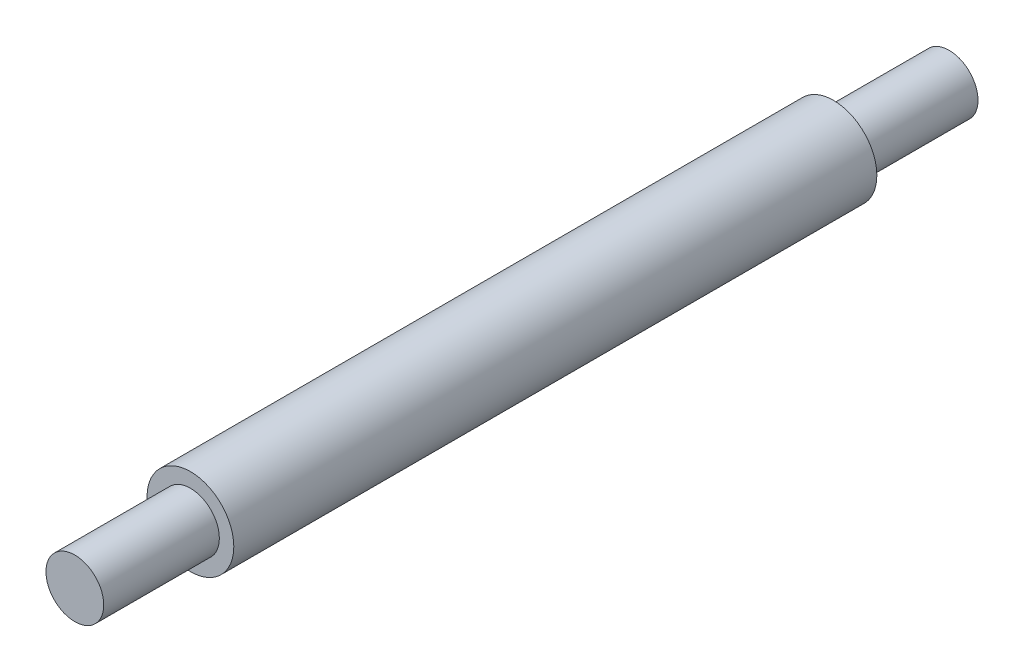
ISO-10303-21;
HEADER;
FILE_DESCRIPTION(('STEP AP214'),'2;1');
FILE_NAME('part.step','',(''),(''),'','','');
FILE_SCHEMA(('AUTOMOTIVE_DESIGN { 1 0 10303 214 1 1 1 1 }'));
ENDSEC;
DATA;
#1=APPLICATION_CONTEXT('core data for automotive mechanical design processes');
#2=APPLICATION_PROTOCOL_DEFINITION('international standard','automotive_design',2000,#1);
#3=PRODUCT_CONTEXT('',#1,'mechanical');
#4=PRODUCT('Part','Part','',(#3));
#5=PRODUCT_RELATED_PRODUCT_CATEGORY('part','',(#4));
#6=PRODUCT_DEFINITION_FORMATION('','',#4);
#7=PRODUCT_DEFINITION_CONTEXT('part definition',#1,'design');
#8=PRODUCT_DEFINITION('design','',#6,#7);
#9=PRODUCT_DEFINITION_SHAPE('','',#8);
#10=(LENGTH_UNIT() NAMED_UNIT(*) SI_UNIT(.MILLI.,.METRE.));
#11=(NAMED_UNIT(*) PLANE_ANGLE_UNIT() SI_UNIT($,.RADIAN.));
#12=(NAMED_UNIT(*) SI_UNIT($,.STERADIAN.) SOLID_ANGLE_UNIT());
#13=UNCERTAINTY_MEASURE_WITH_UNIT(LENGTH_MEASURE(1.E-05),#10,'distance_accuracy_value','');
#14=(GEOMETRIC_REPRESENTATION_CONTEXT(3) GLOBAL_UNCERTAINTY_ASSIGNED_CONTEXT((#13)) GLOBAL_UNIT_ASSIGNED_CONTEXT((#10,
#11,#12)) REPRESENTATION_CONTEXT('',''));
#15=CARTESIAN_POINT('',(0.,0.,0.));
#16=DIRECTION('',(0.,0.,1.));
#17=DIRECTION('',(1.,0.,0.));
#18=AXIS2_PLACEMENT_3D('',#15,#16,#17);
#19=CARTESIAN_POINT('',(0.,0.,0.));
#20=DIRECTION('',(0.,0.,1.));
#21=DIRECTION('',(1.,0.,0.));
#22=AXIS2_PLACEMENT_3D('',#19,#20,#21);
#23=PLANE('',#22);
#24=CARTESIAN_POINT('',(0.,0.,0.));
#25=DIRECTION('',(0.,0.,1.));
#26=DIRECTION('',(1.,0.,0.));
#27=AXIS2_PLACEMENT_3D('',#24,#25,#26);
#28=CIRCLE('',#27,3.);
#29=CARTESIAN_POINT('',(3.,0.,0.));
#30=VERTEX_POINT('',#29);
#31=EDGE_CURVE('E41',#30,#30,#28,.T.);
#32=ORIENTED_EDGE('',*,*,#31,.F.);
#33=EDGE_LOOP('',(#32));
#34=FACE_BOUND('',#33,.T.);
#35=CARTESIAN_POINT('',(0.,0.,0.));
#36=DIRECTION('',(0.,0.,1.));
#37=DIRECTION('',(1.,0.,0.));
#38=AXIS2_PLACEMENT_3D('',#35,#36,#37);
#39=CIRCLE('',#38,2.);
#40=CARTESIAN_POINT('',(2.,0.,0.));
#41=VERTEX_POINT('',#40);
#42=EDGE_CURVE('E10',#41,#41,#39,.F.);
#43=ORIENTED_EDGE('',*,*,#42,.F.);
#44=EDGE_LOOP('',(#43));
#45=FACE_BOUND('',#44,.T.);
#46=ADVANCED_FACE('F30',(#34,#45),#23,.F.);
#47=CARTESIAN_POINT('',(0.,0.,44.5));
#48=DIRECTION('',(0.,0.,1.));
#49=DIRECTION('',(1.,0.,0.));
#50=AXIS2_PLACEMENT_3D('',#47,#48,#49);
#51=PLANE('',#50);
#52=CARTESIAN_POINT('',(0.,0.,44.5));
#53=DIRECTION('',(0.,0.,1.));
#54=DIRECTION('',(1.,0.,0.));
#55=AXIS2_PLACEMENT_3D('',#52,#53,#54);
#56=CIRCLE('',#55,3.);
#57=CARTESIAN_POINT('',(3.,0.,44.5));
#58=VERTEX_POINT('',#57);
#59=EDGE_CURVE('E37',#58,#58,#56,.T.);
#60=ORIENTED_EDGE('',*,*,#59,.T.);
#61=EDGE_LOOP('',(#60));
#62=FACE_BOUND('',#61,.T.);
#63=CARTESIAN_POINT('',(0.,0.,44.5));
#64=DIRECTION('',(0.,0.,1.));
#65=DIRECTION('',(1.,0.,0.));
#66=AXIS2_PLACEMENT_3D('',#63,#64,#65);
#67=CIRCLE('',#66,2.);
#68=CARTESIAN_POINT('',(2.,0.,44.5));
#69=VERTEX_POINT('',#68);
#70=EDGE_CURVE('E48',#69,#69,#67,.T.);
#71=ORIENTED_EDGE('',*,*,#70,.F.);
#72=EDGE_LOOP('',(#71));
#73=FACE_BOUND('',#72,.T.);
#74=ADVANCED_FACE('F72',(#62,#73),#51,.T.);
#75=CARTESIAN_POINT('',(0.,0.,44.5));
#76=DIRECTION('',(0.,0.,-1.));
#77=DIRECTION('',(-1.,0.,0.));
#78=AXIS2_PLACEMENT_3D('',#75,#76,#77);
#79=CYLINDRICAL_SURFACE('',#78,3.);
#80=ORIENTED_EDGE('',*,*,#59,.F.);
#81=EDGE_LOOP('',(#80));
#82=FACE_BOUND('',#81,.T.);
#83=ORIENTED_EDGE('',*,*,#31,.T.);
#84=EDGE_LOOP('',(#83));
#85=FACE_BOUND('',#84,.T.);
#86=ADVANCED_FACE('F32',(#82,#85),#79,.T.);
#87=CARTESIAN_POINT('',(0.,0.,52.5));
#88=DIRECTION('',(0.,0.,-1.));
#89=DIRECTION('',(-1.,0.,0.));
#90=AXIS2_PLACEMENT_3D('',#87,#88,#89);
#91=CYLINDRICAL_SURFACE('',#90,2.);
#92=CARTESIAN_POINT('',(0.,0.,52.5));
#93=DIRECTION('',(0.,0.,1.));
#94=DIRECTION('',(1.,0.,0.));
#95=AXIS2_PLACEMENT_3D('',#92,#93,#94);
#96=CIRCLE('',#95,2.);
#97=CARTESIAN_POINT('',(2.,0.,52.5));
#98=VERTEX_POINT('',#97);
#99=EDGE_CURVE('E46',#98,#98,#96,.T.);
#100=ORIENTED_EDGE('',*,*,#99,.F.);
#101=EDGE_LOOP('',(#100));
#102=FACE_BOUND('',#101,.T.);
#103=ORIENTED_EDGE('',*,*,#70,.T.);
#104=EDGE_LOOP('',(#103));
#105=FACE_BOUND('',#104,.T.);
#106=ADVANCED_FACE('F68',(#102,#105),#91,.T.);
#107=CARTESIAN_POINT('',(0.,0.,52.5));
#108=DIRECTION('',(0.,0.,1.));
#109=DIRECTION('',(1.,0.,0.));
#110=AXIS2_PLACEMENT_3D('',#107,#108,#109);
#111=PLANE('',#110);
#112=ORIENTED_EDGE('',*,*,#99,.T.);
#113=EDGE_LOOP('',(#112));
#114=FACE_BOUND('',#113,.T.);
#115=ADVANCED_FACE('F61',(#114),#111,.T.);
#116=CARTESIAN_POINT('',(0.,0.,-8.));
#117=DIRECTION('',(0.,0.,1.));
#118=DIRECTION('',(1.,0.,0.));
#119=AXIS2_PLACEMENT_3D('',#116,#117,#118);
#120=CYLINDRICAL_SURFACE('',#119,2.);
#121=CARTESIAN_POINT('',(0.,0.,-8.));
#122=DIRECTION('',(0.,0.,-1.));
#123=DIRECTION('',(-1.,0.,0.));
#124=AXIS2_PLACEMENT_3D('',#121,#122,#123);
#125=CIRCLE('',#124,2.);
#126=CARTESIAN_POINT('',(-2.,0.,-8.));
#127=VERTEX_POINT('',#126);
#128=EDGE_CURVE('E51',#127,#127,#125,.T.);
#129=ORIENTED_EDGE('',*,*,#128,.F.);
#130=EDGE_LOOP('',(#129));
#131=FACE_BOUND('',#130,.T.);
#132=ORIENTED_EDGE('',*,*,#42,.T.);
#133=EDGE_LOOP('',(#132));
#134=FACE_BOUND('',#133,.T.);
#135=ADVANCED_FACE('F59',(#131,#134),#120,.T.);
#136=CARTESIAN_POINT('',(0.,0.,-8.));
#137=DIRECTION('',(0.,0.,-1.));
#138=DIRECTION('',(-1.,0.,0.));
#139=AXIS2_PLACEMENT_3D('',#136,#137,#138);
#140=PLANE('',#139);
#141=ORIENTED_EDGE('',*,*,#128,.T.);
#142=EDGE_LOOP('',(#141));
#143=FACE_BOUND('',#142,.T.);
#144=ADVANCED_FACE('F57',(#143),#140,.T.);
#145=CLOSED_SHELL('',(#46,#74,#86,#106,#115,#135,#144));
#146=MANIFOLD_SOLID_BREP('B2',#145);
#147=ADVANCED_BREP_SHAPE_REPRESENTATION('',(#18,#146),#14);
#148=SHAPE_DEFINITION_REPRESENTATION(#9,#147);
ENDSEC;
END-ISO-10303-21;
